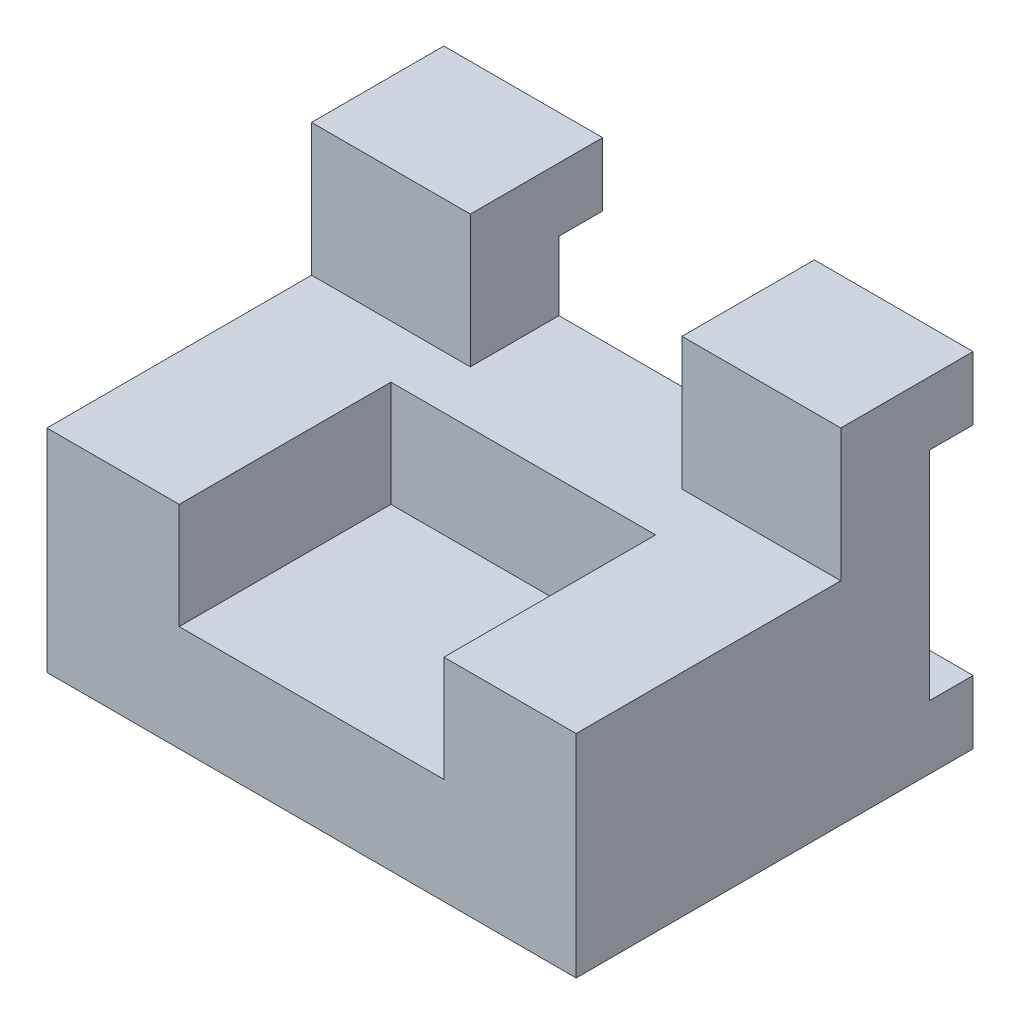
ISO-10303-21;
HEADER;
FILE_DESCRIPTION(('STEP AP214'),'2;1');
FILE_NAME('part.step','',(''),(''),'','','');
FILE_SCHEMA(('AUTOMOTIVE_DESIGN { 1 0 10303 214 1 1 1 1 }'));
ENDSEC;
DATA;
#1=APPLICATION_CONTEXT('core data for automotive mechanical design processes');
#2=APPLICATION_PROTOCOL_DEFINITION('international standard','automotive_design',2000,#1);
#3=PRODUCT_CONTEXT('',#1,'mechanical');
#4=PRODUCT('Part','Part','',(#3));
#5=PRODUCT_RELATED_PRODUCT_CATEGORY('part','',(#4));
#6=PRODUCT_DEFINITION_FORMATION('','',#4);
#7=PRODUCT_DEFINITION_CONTEXT('part definition',#1,'design');
#8=PRODUCT_DEFINITION('design','',#6,#7);
#9=PRODUCT_DEFINITION_SHAPE('','',#8);
#10=(LENGTH_UNIT() NAMED_UNIT(*) SI_UNIT(.MILLI.,.METRE.));
#11=(NAMED_UNIT(*) PLANE_ANGLE_UNIT() SI_UNIT($,.RADIAN.));
#12=(NAMED_UNIT(*) SI_UNIT($,.STERADIAN.) SOLID_ANGLE_UNIT());
#13=UNCERTAINTY_MEASURE_WITH_UNIT(LENGTH_MEASURE(1.E-05),#10,'distance_accuracy_value','');
#14=(GEOMETRIC_REPRESENTATION_CONTEXT(3) GLOBAL_UNCERTAINTY_ASSIGNED_CONTEXT((#13)) GLOBAL_UNIT_ASSIGNED_CONTEXT((#10,
#11,#12)) REPRESENTATION_CONTEXT('',''));
#15=CARTESIAN_POINT('',(0.,0.,0.));
#16=DIRECTION('',(0.,0.,1.));
#17=DIRECTION('',(1.,0.,0.));
#18=AXIS2_PLACEMENT_3D('',#15,#16,#17);
#19=CARTESIAN_POINT('',(0.,0.,25.));
#20=DIRECTION('',(0.,0.,-1.));
#21=DIRECTION('',(-1.,0.,0.));
#22=AXIS2_PLACEMENT_3D('',#19,#20,#21);
#23=PLANE('',#22);
#24=DIRECTION('',(0.,-1.,0.));
#25=VECTOR('',#24,1.);
#26=CARTESIAN_POINT('',(0.,0.,25.));
#27=LINE('',#26,#25);
#28=CARTESIAN_POINT('',(0.,65.,25.));
#29=VERTEX_POINT('',#28);
#30=CARTESIAN_POINT('',(0.,40.,25.));
#31=VERTEX_POINT('',#30);
#32=EDGE_CURVE('E281',#29,#31,#27,.T.);
#33=ORIENTED_EDGE('',*,*,#32,.T.);
#34=DIRECTION('',(1.,0.,0.));
#35=VECTOR('',#34,1.);
#36=CARTESIAN_POINT('',(0.,40.,25.));
#37=LINE('',#36,#35);
#38=CARTESIAN_POINT('',(30.,40.,25.));
#39=VERTEX_POINT('',#38);
#40=EDGE_CURVE('E49',#31,#39,#37,.T.);
#41=ORIENTED_EDGE('',*,*,#40,.T.);
#42=DIRECTION('',(0.,1.,0.));
#43=VECTOR('',#42,1.);
#44=CARTESIAN_POINT('',(30.,40.,25.));
#45=LINE('',#44,#43);
#46=CARTESIAN_POINT('',(30.,65.,25.));
#47=VERTEX_POINT('',#46);
#48=EDGE_CURVE('E242',#39,#47,#45,.T.);
#49=ORIENTED_EDGE('',*,*,#48,.T.);
#50=DIRECTION('',(-1.,0.,0.));
#51=VECTOR('',#50,1.);
#52=CARTESIAN_POINT('',(0.,65.,25.));
#53=LINE('',#52,#51);
#54=EDGE_CURVE('E287',#47,#29,#53,.T.);
#55=ORIENTED_EDGE('',*,*,#54,.T.);
#56=EDGE_LOOP('',(#33,#41,#49,#55));
#57=FACE_BOUND('',#56,.T.);
#58=ADVANCED_FACE('F39',(#57),#23,.F.);
#59=CARTESIAN_POINT('',(0.,65.,25.));
#60=DIRECTION('',(0.,-1.,0.));
#61=DIRECTION('',(0.,0.,-1.));
#62=AXIS2_PLACEMENT_3D('',#59,#60,#61);
#63=PLANE('',#62);
#64=DIRECTION('',(-1.,0.,0.));
#65=VECTOR('',#64,1.);
#66=CARTESIAN_POINT('',(0.,65.,0.));
#67=LINE('',#66,#65);
#68=CARTESIAN_POINT('',(100.,65.,0.));
#69=VERTEX_POINT('',#68);
#70=CARTESIAN_POINT('',(70.,65.,0.));
#71=VERTEX_POINT('',#70);
#72=EDGE_CURVE('E285',#69,#71,#67,.T.);
#73=ORIENTED_EDGE('',*,*,#72,.T.);
#74=DIRECTION('',(0.,0.,-1.));
#75=VECTOR('',#74,1.);
#76=CARTESIAN_POINT('',(70.,65.,0.));
#77=LINE('',#76,#75);
#78=CARTESIAN_POINT('',(70.,65.,25.));
#79=VERTEX_POINT('',#78);
#80=EDGE_CURVE('E230',#79,#71,#77,.T.);
#81=ORIENTED_EDGE('',*,*,#80,.F.);
#82=CARTESIAN_POINT('',(100.,65.,25.));
#83=VERTEX_POINT('',#82);
#84=EDGE_CURVE('E288',#83,#79,#53,.T.);
#85=ORIENTED_EDGE('',*,*,#84,.F.);
#86=DIRECTION('',(0.,0.,-1.));
#87=VECTOR('',#86,1.);
#88=CARTESIAN_POINT('',(100.,65.,25.));
#89=LINE('',#88,#87);
#90=EDGE_CURVE('E306',#83,#69,#89,.T.);
#91=ORIENTED_EDGE('',*,*,#90,.T.);
#92=EDGE_LOOP('',(#73,#81,#85,#91));
#93=FACE_BOUND('',#92,.T.);
#94=ADVANCED_FACE('F367',(#93),#63,.F.);
#95=CARTESIAN_POINT('',(0.,0.,0.));
#96=DIRECTION('',(0.,0.,-1.));
#97=DIRECTION('',(-1.,0.,0.));
#98=AXIS2_PLACEMENT_3D('',#95,#96,#97);
#99=PLANE('',#98);
#100=DIRECTION('',(0.,1.,0.));
#101=VECTOR('',#100,1.);
#102=CARTESIAN_POINT('',(70.,40.,0.));
#103=LINE('',#102,#101);
#104=CARTESIAN_POINT('',(70.,53.,0.));
#105=VERTEX_POINT('',#104);
#106=EDGE_CURVE('E236',#105,#71,#103,.T.);
#107=ORIENTED_EDGE('',*,*,#106,.T.);
#108=ORIENTED_EDGE('',*,*,#72,.F.);
#109=DIRECTION('',(0.,1.,0.));
#110=VECTOR('',#109,1.);
#111=CARTESIAN_POINT('',(100.,0.,0.));
#112=LINE('',#111,#110);
#113=CARTESIAN_POINT('',(100.,53.,0.));
#114=VERTEX_POINT('',#113);
#115=EDGE_CURVE('E297',#114,#69,#112,.T.);
#116=ORIENTED_EDGE('',*,*,#115,.F.);
#117=DIRECTION('',(1.,0.,0.));
#118=VECTOR('',#117,1.);
#119=CARTESIAN_POINT('',(-0.00100000000005651,53.,0.));
#120=LINE('',#119,#118);
#121=EDGE_CURVE('E265',#105,#114,#120,.T.);
#122=ORIENTED_EDGE('',*,*,#121,.F.);
#123=EDGE_LOOP('',(#107,#108,#116,#122));
#124=FACE_BOUND('',#123,.T.);
#125=ADVANCED_FACE('F371',(#124),#99,.T.);
#126=CARTESIAN_POINT('',(-0.00100000000005651,53.,0.));
#127=DIRECTION('',(0.,1.,0.));
#128=DIRECTION('',(-1.,0.,0.));
#129=AXIS2_PLACEMENT_3D('',#126,#127,#128);
#130=PLANE('',#129);
#131=DIRECTION('',(1.,0.,0.));
#132=VECTOR('',#131,1.);
#133=CARTESIAN_POINT('',(-0.00100000000005651,53.,8.23264647234119));
#134=LINE('',#133,#132);
#135=CARTESIAN_POINT('',(70.,53.,8.23264647234119));
#136=VERTEX_POINT('',#135);
#137=CARTESIAN_POINT('',(100.,53.,8.23264647234119));
#138=VERTEX_POINT('',#137);
#139=EDGE_CURVE('E275',#136,#138,#134,.T.);
#140=ORIENTED_EDGE('',*,*,#139,.F.);
#141=DIRECTION('',(0.,0.,-1.));
#142=VECTOR('',#141,1.);
#143=CARTESIAN_POINT('',(70.,53.,0.));
#144=LINE('',#143,#142);
#145=EDGE_CURVE('E317',#136,#105,#144,.T.);
#146=ORIENTED_EDGE('',*,*,#145,.T.);
#147=ORIENTED_EDGE('',*,*,#121,.T.);
#148=DIRECTION('',(0.,0.,1.));
#149=VECTOR('',#148,1.);
#150=CARTESIAN_POINT('',(100.,53.,0.));
#151=LINE('',#150,#149);
#152=EDGE_CURVE('E257',#114,#138,#151,.T.);
#153=ORIENTED_EDGE('',*,*,#152,.T.);
#154=EDGE_LOOP('',(#140,#146,#147,#153));
#155=FACE_BOUND('',#154,.T.);
#156=ADVANCED_FACE('F373',(#155),#130,.F.);
#157=DIRECTION('',(1.,0.,0.));
#158=VECTOR('',#157,1.);
#159=CARTESIAN_POINT('',(-0.00100000000002876,12.,0.));
#160=LINE('',#159,#158);
#161=CARTESIAN_POINT('',(0.,12.,0.));
#162=VERTEX_POINT('',#161);
#163=CARTESIAN_POINT('',(100.,12.,0.));
#164=VERTEX_POINT('',#163);
#165=EDGE_CURVE('E266',#162,#164,#160,.T.);
#166=ORIENTED_EDGE('',*,*,#165,.T.);
#167=CARTESIAN_POINT('',(100.,0.,0.));
#168=VERTEX_POINT('',#167);
#169=EDGE_CURVE('E298',#168,#164,#112,.T.);
#170=ORIENTED_EDGE('',*,*,#169,.F.);
#171=DIRECTION('',(1.,0.,0.));
#172=VECTOR('',#171,1.);
#173=CARTESIAN_POINT('',(0.,0.,0.));
#174=LINE('',#173,#172);
#175=CARTESIAN_POINT('',(0.,0.,0.));
#176=VERTEX_POINT('',#175);
#177=EDGE_CURVE('E295',#176,#168,#174,.T.);
#178=ORIENTED_EDGE('',*,*,#177,.F.);
#179=DIRECTION('',(0.,-1.,0.));
#180=VECTOR('',#179,1.);
#181=CARTESIAN_POINT('',(0.,0.,0.));
#182=LINE('',#181,#180);
#183=EDGE_CURVE('E280',#162,#176,#182,.T.);
#184=ORIENTED_EDGE('',*,*,#183,.F.);
#185=EDGE_LOOP('',(#166,#170,#178,#184));
#186=FACE_BOUND('',#185,.T.);
#187=ADVANCED_FACE('F389',(#186),#99,.T.);
#188=CARTESIAN_POINT('',(0.,0.,25.));
#189=DIRECTION('',(1.,0.,0.));
#190=DIRECTION('',(0.,1.,0.));
#191=AXIS2_PLACEMENT_3D('',#188,#189,#190);
#192=PLANE('',#191);
#193=DIRECTION('',(0.,1.,0.));
#194=VECTOR('',#193,1.);
#195=CARTESIAN_POINT('',(0.,53.,8.23264647234119));
#196=LINE('',#195,#194);
#197=CARTESIAN_POINT('',(0.,12.,8.23264647234119));
#198=VERTEX_POINT('',#197);
#199=CARTESIAN_POINT('',(0.,53.,8.23264647234119));
#200=VERTEX_POINT('',#199);
#201=EDGE_CURVE('E251',#198,#200,#196,.T.);
#202=ORIENTED_EDGE('',*,*,#201,.F.);
#203=DIRECTION('',(0.,0.,1.));
#204=VECTOR('',#203,1.);
#205=CARTESIAN_POINT('',(0.,12.,8.23264647234119));
#206=LINE('',#205,#204);
#207=EDGE_CURVE('E254',#162,#198,#206,.T.);
#208=ORIENTED_EDGE('',*,*,#207,.F.);
#209=ORIENTED_EDGE('',*,*,#183,.T.);
#210=DIRECTION('',(0.,0.,-1.));
#211=VECTOR('',#210,1.);
#212=CARTESIAN_POINT('',(0.,0.,25.));
#213=LINE('',#212,#211);
#214=CARTESIAN_POINT('',(0.,0.,75.));
#215=VERTEX_POINT('',#214);
#216=EDGE_CURVE('E312',#215,#176,#213,.T.);
#217=ORIENTED_EDGE('',*,*,#216,.F.);
#218=DIRECTION('',(0.,-1.,0.));
#219=VECTOR('',#218,1.);
#220=CARTESIAN_POINT('',(0.,0.,75.));
#221=LINE('',#220,#219);
#222=CARTESIAN_POINT('',(0.,40.,75.));
#223=VERTEX_POINT('',#222);
#224=EDGE_CURVE('E211',#223,#215,#221,.T.);
#225=ORIENTED_EDGE('',*,*,#224,.F.);
#226=DIRECTION('',(0.,0.,-1.));
#227=VECTOR('',#226,1.);
#228=CARTESIAN_POINT('',(0.,40.,75.));
#229=LINE('',#228,#227);
#230=EDGE_CURVE('E223',#223,#31,#229,.T.);
#231=ORIENTED_EDGE('',*,*,#230,.T.);
#232=ORIENTED_EDGE('',*,*,#32,.F.);
#233=DIRECTION('',(0.,0.,-1.));
#234=VECTOR('',#233,1.);
#235=CARTESIAN_POINT('',(0.,65.,25.));
#236=LINE('',#235,#234);
#237=CARTESIAN_POINT('',(0.,65.,0.));
#238=VERTEX_POINT('',#237);
#239=EDGE_CURVE('E291',#29,#238,#236,.T.);
#240=ORIENTED_EDGE('',*,*,#239,.T.);
#241=CARTESIAN_POINT('',(0.,53.,0.));
#242=VERTEX_POINT('',#241);
#243=EDGE_CURVE('E292',#238,#242,#182,.T.);
#244=ORIENTED_EDGE('',*,*,#243,.T.);
#245=DIRECTION('',(0.,0.,-1.));
#246=VECTOR('',#245,1.);
#247=CARTESIAN_POINT('',(0.,53.,0.));
#248=LINE('',#247,#246);
#249=EDGE_CURVE('E269',#200,#242,#248,.T.);
#250=ORIENTED_EDGE('',*,*,#249,.F.);
#251=EDGE_LOOP('',(#202,#208,#209,#217,#225,#231,#232,#240,#244,#250));
#252=FACE_BOUND('',#251,.T.);
#253=ADVANCED_FACE('F41',(#252),#192,.F.);
#254=CARTESIAN_POINT('',(0.,0.,25.));
#255=DIRECTION('',(0.,1.,0.));
#256=DIRECTION('',(0.,0.,1.));
#257=AXIS2_PLACEMENT_3D('',#254,#255,#256);
#258=PLANE('',#257);
#259=ORIENTED_EDGE('',*,*,#177,.T.);
#260=DIRECTION('',(0.,0.,-1.));
#261=VECTOR('',#260,1.);
#262=CARTESIAN_POINT('',(100.,0.,25.));
#263=LINE('',#262,#261);
#264=CARTESIAN_POINT('',(100.,0.,75.));
#265=VERTEX_POINT('',#264);
#266=EDGE_CURVE('E309',#265,#168,#263,.T.);
#267=ORIENTED_EDGE('',*,*,#266,.F.);
#268=DIRECTION('',(1.,0.,0.));
#269=VECTOR('',#268,1.);
#270=CARTESIAN_POINT('',(0.,0.,75.));
#271=LINE('',#270,#269);
#272=EDGE_CURVE('E215',#215,#265,#271,.T.);
#273=ORIENTED_EDGE('',*,*,#272,.F.);
#274=ORIENTED_EDGE('',*,*,#216,.T.);
#275=EDGE_LOOP('',(#259,#267,#273,#274));
#276=FACE_BOUND('',#275,.T.);
#277=ADVANCED_FACE('F504',(#276),#258,.F.);
#278=CARTESIAN_POINT('',(100.,0.,25.));
#279=DIRECTION('',(-1.,0.,0.));
#280=DIRECTION('',(0.,-1.,0.));
#281=AXIS2_PLACEMENT_3D('',#278,#279,#280);
#282=PLANE('',#281);
#283=ORIENTED_EDGE('',*,*,#169,.T.);
#284=DIRECTION('',(0.,0.,-1.));
#285=VECTOR('',#284,1.);
#286=CARTESIAN_POINT('',(100.,12.,8.23264647234119));
#287=LINE('',#286,#285);
#288=CARTESIAN_POINT('',(100.,12.,8.23264647234119));
#289=VERTEX_POINT('',#288);
#290=EDGE_CURVE('E263',#289,#164,#287,.T.);
#291=ORIENTED_EDGE('',*,*,#290,.F.);
#292=DIRECTION('',(0.,-1.,0.));
#293=VECTOR('',#292,1.);
#294=CARTESIAN_POINT('',(100.,53.,8.23264647234119));
#295=LINE('',#294,#293);
#296=EDGE_CURVE('E260',#138,#289,#295,.T.);
#297=ORIENTED_EDGE('',*,*,#296,.F.);
#298=ORIENTED_EDGE('',*,*,#152,.F.);
#299=ORIENTED_EDGE('',*,*,#115,.T.);
#300=ORIENTED_EDGE('',*,*,#90,.F.);
#301=DIRECTION('',(0.,1.,0.));
#302=VECTOR('',#301,1.);
#303=CARTESIAN_POINT('',(100.,0.,25.));
#304=LINE('',#303,#302);
#305=CARTESIAN_POINT('',(100.,40.,25.));
#306=VERTEX_POINT('',#305);
#307=EDGE_CURVE('E284',#306,#83,#304,.T.);
#308=ORIENTED_EDGE('',*,*,#307,.F.);
#309=DIRECTION('',(0.,0.,-1.));
#310=VECTOR('',#309,1.);
#311=CARTESIAN_POINT('',(100.,40.,75.));
#312=LINE('',#311,#310);
#313=CARTESIAN_POINT('',(100.,40.,75.));
#314=VERTEX_POINT('',#313);
#315=EDGE_CURVE('E220',#314,#306,#312,.T.);
#316=ORIENTED_EDGE('',*,*,#315,.F.);
#317=DIRECTION('',(0.,1.,0.));
#318=VECTOR('',#317,1.);
#319=CARTESIAN_POINT('',(100.,0.,75.));
#320=LINE('',#319,#318);
#321=EDGE_CURVE('E218',#265,#314,#320,.T.);
#322=ORIENTED_EDGE('',*,*,#321,.F.);
#323=ORIENTED_EDGE('',*,*,#266,.T.);
#324=EDGE_LOOP('',(#283,#291,#297,#298,#299,#300,#308,#316,#322,#323));
#325=FACE_BOUND('',#324,.T.);
#326=ADVANCED_FACE('F357',(#325),#282,.F.);
#327=ORIENTED_EDGE('',*,*,#54,.F.);
#328=DIRECTION('',(0.,0.,1.));
#329=VECTOR('',#328,1.);
#330=CARTESIAN_POINT('',(30.,65.,0.));
#331=LINE('',#330,#329);
#332=CARTESIAN_POINT('',(30.,65.,0.));
#333=VERTEX_POINT('',#332);
#334=EDGE_CURVE('E225',#333,#47,#331,.T.);
#335=ORIENTED_EDGE('',*,*,#334,.F.);
#336=EDGE_CURVE('E301',#333,#238,#67,.T.);
#337=ORIENTED_EDGE('',*,*,#336,.T.);
#338=ORIENTED_EDGE('',*,*,#239,.F.);
#339=EDGE_LOOP('',(#327,#335,#337,#338));
#340=FACE_BOUND('',#339,.T.);
#341=ADVANCED_FACE('F337',(#340),#63,.F.);
#342=DIRECTION('',(0.,1.,0.));
#343=VECTOR('',#342,1.);
#344=CARTESIAN_POINT('',(70.,40.,25.));
#345=LINE('',#344,#343);
#346=CARTESIAN_POINT('',(70.,40.,25.));
#347=VERTEX_POINT('',#346);
#348=EDGE_CURVE('E240',#347,#79,#345,.T.);
#349=ORIENTED_EDGE('',*,*,#348,.F.);
#350=EDGE_CURVE('E11',#347,#306,#37,.T.);
#351=ORIENTED_EDGE('',*,*,#350,.T.);
#352=ORIENTED_EDGE('',*,*,#307,.T.);
#353=ORIENTED_EDGE('',*,*,#84,.T.);
#354=EDGE_LOOP('',(#349,#351,#352,#353));
#355=FACE_BOUND('',#354,.T.);
#356=ADVANCED_FACE('F361',(#355),#23,.F.);
#357=DIRECTION('',(0.,1.,0.));
#358=VECTOR('',#357,1.);
#359=CARTESIAN_POINT('',(30.,40.,0.));
#360=LINE('',#359,#358);
#361=CARTESIAN_POINT('',(30.,53.,0.));
#362=VERTEX_POINT('',#361);
#363=EDGE_CURVE('E233',#362,#333,#360,.T.);
#364=ORIENTED_EDGE('',*,*,#363,.F.);
#365=EDGE_CURVE('E276',#242,#362,#120,.T.);
#366=ORIENTED_EDGE('',*,*,#365,.F.);
#367=ORIENTED_EDGE('',*,*,#243,.F.);
#368=ORIENTED_EDGE('',*,*,#336,.F.);
#369=EDGE_LOOP('',(#364,#366,#367,#368));
#370=FACE_BOUND('',#369,.T.);
#371=ADVANCED_FACE('F386',(#370),#99,.T.);
#372=CARTESIAN_POINT('',(-0.00100000000002876,12.,8.23264647234119));
#373=DIRECTION('',(0.,-1.,0.));
#374=DIRECTION('',(1.,0.,0.));
#375=AXIS2_PLACEMENT_3D('',#372,#373,#374);
#376=PLANE('',#375);
#377=ORIENTED_EDGE('',*,*,#207,.T.);
#378=DIRECTION('',(1.,0.,0.));
#379=VECTOR('',#378,1.);
#380=CARTESIAN_POINT('',(-0.00100000000002876,12.,8.23264647234119));
#381=LINE('',#380,#379);
#382=EDGE_CURVE('E270',#198,#289,#381,.T.);
#383=ORIENTED_EDGE('',*,*,#382,.T.);
#384=ORIENTED_EDGE('',*,*,#290,.T.);
#385=ORIENTED_EDGE('',*,*,#165,.F.);
#386=EDGE_LOOP('',(#377,#383,#384,#385));
#387=FACE_BOUND('',#386,.T.);
#388=ADVANCED_FACE('F379',(#387),#376,.F.);
#389=CARTESIAN_POINT('',(-0.00100000000005651,53.,8.23264647234119));
#390=DIRECTION('',(0.,0.,1.));
#391=DIRECTION('',(0.,-1.,0.));
#392=AXIS2_PLACEMENT_3D('',#389,#390,#391);
#393=PLANE('',#392);
#394=DIRECTION('',(1.,0.,0.));
#395=VECTOR('',#394,1.);
#396=CARTESIAN_POINT('',(-0.00100000000005651,40.,8.23264647234119));
#397=LINE('',#396,#395);
#398=CARTESIAN_POINT('',(30.,40.,8.23264647234119));
#399=VERTEX_POINT('',#398);
#400=CARTESIAN_POINT('',(70.,40.,8.23264647234119));
#401=VERTEX_POINT('',#400);
#402=EDGE_CURVE('E43',#399,#401,#397,.T.);
#403=ORIENTED_EDGE('',*,*,#402,.T.);
#404=DIRECTION('',(0.,1.,0.));
#405=VECTOR('',#404,1.);
#406=CARTESIAN_POINT('',(70.,53.,8.23264647234119));
#407=LINE('',#406,#405);
#408=EDGE_CURVE('E248',#401,#136,#407,.T.);
#409=ORIENTED_EDGE('',*,*,#408,.T.);
#410=ORIENTED_EDGE('',*,*,#139,.T.);
#411=ORIENTED_EDGE('',*,*,#296,.T.);
#412=ORIENTED_EDGE('',*,*,#382,.F.);
#413=ORIENTED_EDGE('',*,*,#201,.T.);
#414=CARTESIAN_POINT('',(30.,53.,8.23264647234119));
#415=VERTEX_POINT('',#414);
#416=EDGE_CURVE('E272',#200,#415,#134,.T.);
#417=ORIENTED_EDGE('',*,*,#416,.T.);
#418=DIRECTION('',(0.,-1.,0.));
#419=VECTOR('',#418,1.);
#420=CARTESIAN_POINT('',(30.,53.,8.23264647234119));
#421=LINE('',#420,#419);
#422=EDGE_CURVE('E239',#415,#399,#421,.T.);
#423=ORIENTED_EDGE('',*,*,#422,.T.);
#424=EDGE_LOOP('',(#403,#409,#410,#411,#412,#413,#417,#423));
#425=FACE_BOUND('',#424,.T.);
#426=ADVANCED_FACE('F324',(#425),#393,.F.);
#427=ORIENTED_EDGE('',*,*,#365,.T.);
#428=DIRECTION('',(0.,0.,1.));
#429=VECTOR('',#428,1.);
#430=CARTESIAN_POINT('',(30.,53.,0.));
#431=LINE('',#430,#429);
#432=EDGE_CURVE('E315',#362,#415,#431,.T.);
#433=ORIENTED_EDGE('',*,*,#432,.T.);
#434=ORIENTED_EDGE('',*,*,#416,.F.);
#435=ORIENTED_EDGE('',*,*,#249,.T.);
#436=EDGE_LOOP('',(#427,#433,#434,#435));
#437=FACE_BOUND('',#436,.T.);
#438=ADVANCED_FACE('F383',(#437),#130,.F.);
#439=CARTESIAN_POINT('',(0.,40.,0.));
#440=DIRECTION('',(0.,-1.,0.));
#441=DIRECTION('',(0.,0.,-1.));
#442=AXIS2_PLACEMENT_3D('',#439,#440,#441);
#443=PLANE('',#442);
#444=DIRECTION('',(1.,0.,0.));
#445=VECTOR('',#444,1.);
#446=CARTESIAN_POINT('',(0.,40.,75.));
#447=LINE('',#446,#445);
#448=CARTESIAN_POINT('',(25.,40.,75.));
#449=VERTEX_POINT('',#448);
#450=EDGE_CURVE('E209',#223,#449,#447,.T.);
#451=ORIENTED_EDGE('',*,*,#450,.T.);
#452=DIRECTION('',(0.,0.,-1.));
#453=VECTOR('',#452,1.);
#454=CARTESIAN_POINT('',(25.,40.,35.));
#455=LINE('',#454,#453);
#456=CARTESIAN_POINT('',(25.,40.,35.));
#457=VERTEX_POINT('',#456);
#458=EDGE_CURVE('E56',#449,#457,#455,.T.);
#459=ORIENTED_EDGE('',*,*,#458,.T.);
#460=DIRECTION('',(1.,0.,0.));
#461=VECTOR('',#460,1.);
#462=CARTESIAN_POINT('',(75.,40.,35.));
#463=LINE('',#462,#461);
#464=CARTESIAN_POINT('',(75.,40.,35.));
#465=VERTEX_POINT('',#464);
#466=EDGE_CURVE('E60',#457,#465,#463,.T.);
#467=ORIENTED_EDGE('',*,*,#466,.T.);
#468=DIRECTION('',(0.,0.,1.));
#469=VECTOR('',#468,1.);
#470=CARTESIAN_POINT('',(75.,40.,75.));
#471=LINE('',#470,#469);
#472=CARTESIAN_POINT('',(75.,40.,75.));
#473=VERTEX_POINT('',#472);
#474=EDGE_CURVE('E187',#465,#473,#471,.T.);
#475=ORIENTED_EDGE('',*,*,#474,.T.);
#476=EDGE_CURVE('E212',#473,#314,#447,.T.);
#477=ORIENTED_EDGE('',*,*,#476,.T.);
#478=ORIENTED_EDGE('',*,*,#315,.T.);
#479=ORIENTED_EDGE('',*,*,#350,.F.);
#480=DIRECTION('',(0.,0.,-1.));
#481=VECTOR('',#480,1.);
#482=CARTESIAN_POINT('',(70.,40.,0.));
#483=LINE('',#482,#481);
#484=EDGE_CURVE('E229',#347,#401,#483,.T.);
#485=ORIENTED_EDGE('',*,*,#484,.T.);
#486=ORIENTED_EDGE('',*,*,#402,.F.);
#487=DIRECTION('',(0.,0.,1.));
#488=VECTOR('',#487,1.);
#489=CARTESIAN_POINT('',(30.,40.,0.));
#490=LINE('',#489,#488);
#491=EDGE_CURVE('E226',#399,#39,#490,.T.);
#492=ORIENTED_EDGE('',*,*,#491,.T.);
#493=ORIENTED_EDGE('',*,*,#40,.F.);
#494=ORIENTED_EDGE('',*,*,#230,.F.);
#495=EDGE_LOOP('',(#451,#459,#467,#475,#477,#478,#479,#485,#486,#492,#493,#494));
#496=FACE_BOUND('',#495,.T.);
#497=ADVANCED_FACE('F326',(#496),#443,.F.);
#498=CARTESIAN_POINT('',(70.,40.,0.));
#499=DIRECTION('',(1.,0.,0.));
#500=DIRECTION('',(0.,0.,-1.));
#501=AXIS2_PLACEMENT_3D('',#498,#499,#500);
#502=PLANE('',#501);
#503=ORIENTED_EDGE('',*,*,#484,.F.);
#504=ORIENTED_EDGE('',*,*,#348,.T.);
#505=ORIENTED_EDGE('',*,*,#80,.T.);
#506=ORIENTED_EDGE('',*,*,#106,.F.);
#507=ORIENTED_EDGE('',*,*,#145,.F.);
#508=ORIENTED_EDGE('',*,*,#408,.F.);
#509=EDGE_LOOP('',(#503,#504,#505,#506,#507,#508));
#510=FACE_BOUND('',#509,.T.);
#511=ADVANCED_FACE('F365',(#510),#502,.F.);
#512=CARTESIAN_POINT('',(30.,40.,0.));
#513=DIRECTION('',(-1.,0.,0.));
#514=DIRECTION('',(0.,0.,1.));
#515=AXIS2_PLACEMENT_3D('',#512,#513,#514);
#516=PLANE('',#515);
#517=ORIENTED_EDGE('',*,*,#432,.F.);
#518=ORIENTED_EDGE('',*,*,#363,.T.);
#519=ORIENTED_EDGE('',*,*,#334,.T.);
#520=ORIENTED_EDGE('',*,*,#48,.F.);
#521=ORIENTED_EDGE('',*,*,#491,.F.);
#522=ORIENTED_EDGE('',*,*,#422,.F.);
#523=EDGE_LOOP('',(#517,#518,#519,#520,#521,#522));
#524=FACE_BOUND('',#523,.T.);
#525=ADVANCED_FACE('F331',(#524),#516,.F.);
#526=CARTESIAN_POINT('',(0.,0.,75.));
#527=DIRECTION('',(0.,0.,1.));
#528=DIRECTION('',(1.,0.,0.));
#529=AXIS2_PLACEMENT_3D('',#526,#527,#528);
#530=PLANE('',#529);
#531=DIRECTION('',(0.,-1.,0.));
#532=VECTOR('',#531,1.);
#533=CARTESIAN_POINT('',(25.,216.112535045067,75.));
#534=LINE('',#533,#532);
#535=CARTESIAN_POINT('',(25.,20.,75.));
#536=VERTEX_POINT('',#535);
#537=EDGE_CURVE('E199',#449,#536,#534,.T.);
#538=ORIENTED_EDGE('',*,*,#537,.F.);
#539=ORIENTED_EDGE('',*,*,#450,.F.);
#540=ORIENTED_EDGE('',*,*,#224,.T.);
#541=ORIENTED_EDGE('',*,*,#272,.T.);
#542=ORIENTED_EDGE('',*,*,#321,.T.);
#543=ORIENTED_EDGE('',*,*,#476,.F.);
#544=DIRECTION('',(0.,-1.,0.));
#545=VECTOR('',#544,1.);
#546=CARTESIAN_POINT('',(75.,216.112535045067,75.));
#547=LINE('',#546,#545);
#548=CARTESIAN_POINT('',(75.,20.,75.));
#549=VERTEX_POINT('',#548);
#550=EDGE_CURVE('E200',#473,#549,#547,.T.);
#551=ORIENTED_EDGE('',*,*,#550,.T.);
#552=DIRECTION('',(1.,0.,0.));
#553=VECTOR('',#552,1.);
#554=CARTESIAN_POINT('',(0.,20.,75.));
#555=LINE('',#554,#553);
#556=EDGE_CURVE('E183',#536,#549,#555,.T.);
#557=ORIENTED_EDGE('',*,*,#556,.F.);
#558=EDGE_LOOP('',(#538,#539,#540,#541,#542,#543,#551,#557));
#559=FACE_BOUND('',#558,.T.);
#560=ADVANCED_FACE('F351',(#559),#530,.T.);
#561=CARTESIAN_POINT('',(25.,216.112535045067,35.));
#562=DIRECTION('',(1.,0.,0.));
#563=DIRECTION('',(0.,0.,-1.));
#564=AXIS2_PLACEMENT_3D('',#561,#562,#563);
#565=PLANE('',#564);
#566=ORIENTED_EDGE('',*,*,#458,.F.);
#567=ORIENTED_EDGE('',*,*,#537,.T.);
#568=DIRECTION('',(0.,0.,-1.));
#569=VECTOR('',#568,1.);
#570=CARTESIAN_POINT('',(25.,20.,35.));
#571=LINE('',#570,#569);
#572=CARTESIAN_POINT('',(25.,20.,35.));
#573=VERTEX_POINT('',#572);
#574=EDGE_CURVE('E196',#536,#573,#571,.T.);
#575=ORIENTED_EDGE('',*,*,#574,.T.);
#576=DIRECTION('',(0.,-1.,0.));
#577=VECTOR('',#576,1.);
#578=CARTESIAN_POINT('',(25.,216.112535045067,35.));
#579=LINE('',#578,#577);
#580=EDGE_CURVE('E195',#457,#573,#579,.T.);
#581=ORIENTED_EDGE('',*,*,#580,.F.);
#582=EDGE_LOOP('',(#566,#567,#575,#581));
#583=FACE_BOUND('',#582,.T.);
#584=ADVANCED_FACE('F347',(#583),#565,.T.);
#585=CARTESIAN_POINT('',(75.,216.112535045067,35.));
#586=DIRECTION('',(0.,0.,1.));
#587=DIRECTION('',(1.,0.,0.));
#588=AXIS2_PLACEMENT_3D('',#585,#586,#587);
#589=PLANE('',#588);
#590=ORIENTED_EDGE('',*,*,#466,.F.);
#591=ORIENTED_EDGE('',*,*,#580,.T.);
#592=DIRECTION('',(1.,0.,0.));
#593=VECTOR('',#592,1.);
#594=CARTESIAN_POINT('',(75.,20.,35.));
#595=LINE('',#594,#593);
#596=CARTESIAN_POINT('',(75.,20.,35.));
#597=VERTEX_POINT('',#596);
#598=EDGE_CURVE('E181',#573,#597,#595,.T.);
#599=ORIENTED_EDGE('',*,*,#598,.T.);
#600=DIRECTION('',(0.,-1.,0.));
#601=VECTOR('',#600,1.);
#602=CARTESIAN_POINT('',(75.,216.112535045067,35.));
#603=LINE('',#602,#601);
#604=EDGE_CURVE('E193',#465,#597,#603,.T.);
#605=ORIENTED_EDGE('',*,*,#604,.F.);
#606=EDGE_LOOP('',(#590,#591,#599,#605));
#607=FACE_BOUND('',#606,.T.);
#608=ADVANCED_FACE('F192',(#607),#589,.T.);
#609=CARTESIAN_POINT('',(75.,216.112535045067,75.));
#610=DIRECTION('',(-1.,0.,0.));
#611=DIRECTION('',(0.,0.,1.));
#612=AXIS2_PLACEMENT_3D('',#609,#610,#611);
#613=PLANE('',#612);
#614=ORIENTED_EDGE('',*,*,#474,.F.);
#615=ORIENTED_EDGE('',*,*,#604,.T.);
#616=DIRECTION('',(0.,0.,1.));
#617=VECTOR('',#616,1.);
#618=CARTESIAN_POINT('',(75.,20.,75.));
#619=LINE('',#618,#617);
#620=EDGE_CURVE('E177',#597,#549,#619,.T.);
#621=ORIENTED_EDGE('',*,*,#620,.T.);
#622=ORIENTED_EDGE('',*,*,#550,.F.);
#623=EDGE_LOOP('',(#614,#615,#621,#622));
#624=FACE_BOUND('',#623,.T.);
#625=ADVANCED_FACE('F198',(#624),#613,.T.);
#626=CARTESIAN_POINT('',(0.,20.,0.));
#627=DIRECTION('',(0.,-1.,0.));
#628=DIRECTION('',(0.,0.,-1.));
#629=AXIS2_PLACEMENT_3D('',#626,#627,#628);
#630=PLANE('',#629);
#631=ORIENTED_EDGE('',*,*,#556,.T.);
#632=ORIENTED_EDGE('',*,*,#620,.F.);
#633=ORIENTED_EDGE('',*,*,#598,.F.);
#634=ORIENTED_EDGE('',*,*,#574,.F.);
#635=EDGE_LOOP('',(#631,#632,#633,#634));
#636=FACE_BOUND('',#635,.T.);
#637=ADVANCED_FACE('F179',(#636),#630,.F.);
#638=CLOSED_SHELL('',(#58,#94,#125,#156,#187,#253,#277,#326,#341,#356,#371,#388,#426,#438,#497,
#511,#525,#560,#584,#608,#625,#637));
#639=MANIFOLD_SOLID_BREP('B2',#638);
#640=ADVANCED_BREP_SHAPE_REPRESENTATION('',(#18,#639),#14);
#641=SHAPE_DEFINITION_REPRESENTATION(#9,#640);
ENDSEC;
END-ISO-10303-21;
